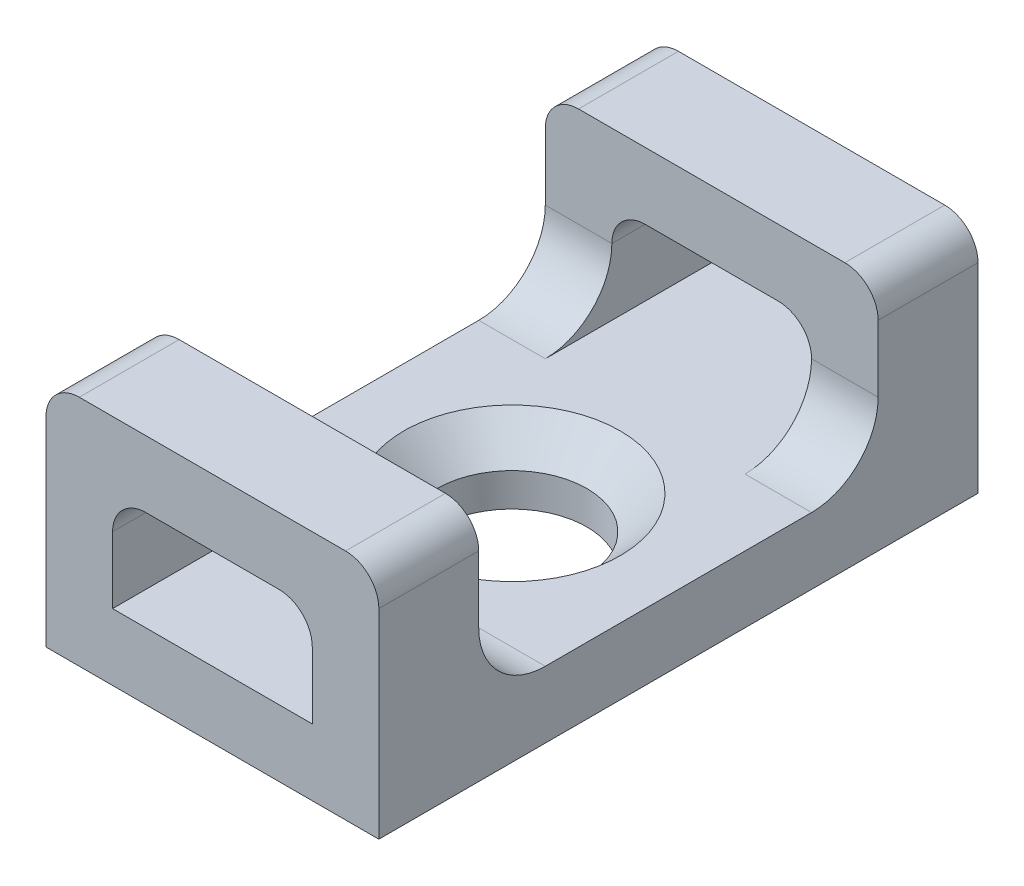
ISO-10303-21;
HEADER;
FILE_DESCRIPTION(('STEP AP214'),'2;1');
FILE_NAME('part.step','',(''),(''),'','','');
FILE_SCHEMA(('AUTOMOTIVE_DESIGN { 1 0 10303 214 1 1 1 1 }'));
ENDSEC;
DATA;
#1=APPLICATION_CONTEXT('core data for automotive mechanical design processes');
#2=APPLICATION_PROTOCOL_DEFINITION('international standard','automotive_design',2000,#1);
#3=PRODUCT_CONTEXT('',#1,'mechanical');
#4=PRODUCT('Part','Part','',(#3));
#5=PRODUCT_RELATED_PRODUCT_CATEGORY('part','',(#4));
#6=PRODUCT_DEFINITION_FORMATION('','',#4);
#7=PRODUCT_DEFINITION_CONTEXT('part definition',#1,'design');
#8=PRODUCT_DEFINITION('design','',#6,#7);
#9=PRODUCT_DEFINITION_SHAPE('','',#8);
#10=(LENGTH_UNIT() NAMED_UNIT(*) SI_UNIT(.MILLI.,.METRE.));
#11=(NAMED_UNIT(*) PLANE_ANGLE_UNIT() SI_UNIT($,.RADIAN.));
#12=(NAMED_UNIT(*) SI_UNIT($,.STERADIAN.) SOLID_ANGLE_UNIT());
#13=UNCERTAINTY_MEASURE_WITH_UNIT(LENGTH_MEASURE(1.E-05),#10,'distance_accuracy_value','');
#14=(GEOMETRIC_REPRESENTATION_CONTEXT(3) GLOBAL_UNCERTAINTY_ASSIGNED_CONTEXT((#13)) GLOBAL_UNIT_ASSIGNED_CONTEXT((#10,
#11,#12)) REPRESENTATION_CONTEXT('',''));
#15=CARTESIAN_POINT('',(0.,0.,0.));
#16=DIRECTION('',(0.,0.,1.));
#17=DIRECTION('',(1.,0.,0.));
#18=AXIS2_PLACEMENT_3D('',#15,#16,#17);
#19=CARTESIAN_POINT('',(0.,2.,0.));
#20=DIRECTION('',(0.,-1.,0.));
#21=DIRECTION('',(0.,0.,-1.));
#22=AXIS2_PLACEMENT_3D('',#19,#20,#21);
#23=PLANE('',#22);
#24=CARTESIAN_POINT('',(5.,2.,-9.));
#25=DIRECTION('',(0.,-1.,0.));
#26=DIRECTION('',(0.,0.,-1.));
#27=AXIS2_PLACEMENT_3D('',#24,#25,#26);
#28=CIRCLE('',#27,3.25);
#29=CARTESIAN_POINT('',(5.,2.,-12.25));
#30=VERTEX_POINT('',#29);
#31=EDGE_CURVE('E271',#30,#30,#28,.T.);
#32=ORIENTED_EDGE('',*,*,#31,.T.);
#33=EDGE_LOOP('',(#32));
#34=FACE_BOUND('',#33,.T.);
#35=DIRECTION('',(0.,0.,1.));
#36=VECTOR('',#35,1.);
#37=CARTESIAN_POINT('',(8.,2.,-3.));
#38=LINE('',#37,#36);
#39=CARTESIAN_POINT('',(8.,2.,-5.));
#40=VERTEX_POINT('',#39);
#41=CARTESIAN_POINT('',(8.,2.,0.));
#42=VERTEX_POINT('',#41);
#43=EDGE_CURVE('E322',#40,#42,#38,.T.);
#44=ORIENTED_EDGE('',*,*,#43,.F.);
#45=DIRECTION('',(-1.,0.,0.));
#46=VECTOR('',#45,1.);
#47=CARTESIAN_POINT('',(10.,2.,-5.));
#48=LINE('',#47,#46);
#49=CARTESIAN_POINT('',(10.,2.,-5.));
#50=VERTEX_POINT('',#49);
#51=EDGE_CURVE('E256',#40,#50,#48,.F.);
#52=ORIENTED_EDGE('',*,*,#51,.T.);
#53=DIRECTION('',(0.,0.,-1.));
#54=VECTOR('',#53,1.);
#55=CARTESIAN_POINT('',(10.,2.,0.));
#56=LINE('',#55,#54);
#57=CARTESIAN_POINT('',(10.,2.,-13.));
#58=VERTEX_POINT('',#57);
#59=EDGE_CURVE('E302',#50,#58,#56,.T.);
#60=ORIENTED_EDGE('',*,*,#59,.T.);
#61=DIRECTION('',(-1.,0.,0.));
#62=VECTOR('',#61,1.);
#63=CARTESIAN_POINT('',(0.,2.,-13.));
#64=LINE('',#63,#62);
#65=CARTESIAN_POINT('',(8.,2.,-13.));
#66=VERTEX_POINT('',#65);
#67=EDGE_CURVE('E262',#58,#66,#64,.T.);
#68=ORIENTED_EDGE('',*,*,#67,.T.);
#69=DIRECTION('',(0.,0.,-1.));
#70=VECTOR('',#69,1.);
#71=CARTESIAN_POINT('',(8.,2.,-15.));
#72=LINE('',#71,#70);
#73=CARTESIAN_POINT('',(8.,2.,-18.));
#74=VERTEX_POINT('',#73);
#75=EDGE_CURVE('E384',#66,#74,#72,.T.);
#76=ORIENTED_EDGE('',*,*,#75,.T.);
#77=DIRECTION('',(-1.,0.,0.));
#78=VECTOR('',#77,1.);
#79=CARTESIAN_POINT('',(0.,2.,-18.));
#80=LINE('',#79,#78);
#81=CARTESIAN_POINT('',(2.,2.,-18.));
#82=VERTEX_POINT('',#81);
#83=EDGE_CURVE('E289',#74,#82,#80,.T.);
#84=ORIENTED_EDGE('',*,*,#83,.T.);
#85=DIRECTION('',(0.,0.,-1.));
#86=VECTOR('',#85,1.);
#87=CARTESIAN_POINT('',(2.,2.,-15.));
#88=LINE('',#87,#86);
#89=CARTESIAN_POINT('',(2.,2.,-13.));
#90=VERTEX_POINT('',#89);
#91=EDGE_CURVE('E399',#90,#82,#88,.T.);
#92=ORIENTED_EDGE('',*,*,#91,.F.);
#93=DIRECTION('',(-1.,0.,0.));
#94=VECTOR('',#93,1.);
#95=CARTESIAN_POINT('',(0.,2.,-13.));
#96=LINE('',#95,#94);
#97=CARTESIAN_POINT('',(0.,2.,-13.));
#98=VERTEX_POINT('',#97);
#99=EDGE_CURVE('E243',#90,#98,#96,.T.);
#100=ORIENTED_EDGE('',*,*,#99,.T.);
#101=DIRECTION('',(0.,0.,1.));
#102=VECTOR('',#101,1.);
#103=CARTESIAN_POINT('',(0.,2.,0.));
#104=LINE('',#103,#102);
#105=CARTESIAN_POINT('',(0.,2.,-5.));
#106=VERTEX_POINT('',#105);
#107=EDGE_CURVE('E292',#98,#106,#104,.T.);
#108=ORIENTED_EDGE('',*,*,#107,.T.);
#109=DIRECTION('',(-1.,0.,0.));
#110=VECTOR('',#109,1.);
#111=CARTESIAN_POINT('',(2.,2.,-5.));
#112=LINE('',#111,#110);
#113=CARTESIAN_POINT('',(2.,2.,-5.));
#114=VERTEX_POINT('',#113);
#115=EDGE_CURVE('E258',#106,#114,#112,.F.);
#116=ORIENTED_EDGE('',*,*,#115,.T.);
#117=DIRECTION('',(0.,0.,1.));
#118=VECTOR('',#117,1.);
#119=CARTESIAN_POINT('',(2.,2.,-3.));
#120=LINE('',#119,#118);
#121=CARTESIAN_POINT('',(2.,2.,0.));
#122=VERTEX_POINT('',#121);
#123=EDGE_CURVE('E311',#114,#122,#120,.T.);
#124=ORIENTED_EDGE('',*,*,#123,.T.);
#125=DIRECTION('',(1.,0.,0.));
#126=VECTOR('',#125,1.);
#127=CARTESIAN_POINT('',(0.,2.,0.));
#128=LINE('',#127,#126);
#129=EDGE_CURVE('E305',#122,#42,#128,.T.);
#130=ORIENTED_EDGE('',*,*,#129,.T.);
#131=EDGE_LOOP('',(#44,#52,#60,#68,#76,#84,#92,#100,#108,#116,#124,#130));
#132=FACE_BOUND('',#131,.T.);
#133=ADVANCED_FACE('F37',(#34,#132),#23,.F.);
#134=CARTESIAN_POINT('',(0.,2.,0.));
#135=DIRECTION('',(1.,0.,0.));
#136=DIRECTION('',(0.,0.,-1.));
#137=AXIS2_PLACEMENT_3D('',#134,#135,#136);
#138=PLANE('',#137);
#139=DIRECTION('',(0.,0.,1.));
#140=VECTOR('',#139,1.);
#141=CARTESIAN_POINT('',(0.,0.,0.));
#142=LINE('',#141,#140);
#143=CARTESIAN_POINT('',(0.,0.,-18.));
#144=VERTEX_POINT('',#143);
#145=CARTESIAN_POINT('',(0.,0.,0.));
#146=VERTEX_POINT('',#145);
#147=EDGE_CURVE('E297',#144,#146,#142,.T.);
#148=ORIENTED_EDGE('',*,*,#147,.T.);
#149=DIRECTION('',(0.,-1.,0.));
#150=VECTOR('',#149,1.);
#151=CARTESIAN_POINT('',(0.,2.,0.));
#152=LINE('',#151,#150);
#153=CARTESIAN_POINT('',(0.,6.,0.));
#154=VERTEX_POINT('',#153);
#155=EDGE_CURVE('E277',#154,#146,#152,.T.);
#156=ORIENTED_EDGE('',*,*,#155,.F.);
#157=DIRECTION('',(0.,0.,1.));
#158=VECTOR('',#157,1.);
#159=CARTESIAN_POINT('',(0.,6.,-3.));
#160=LINE('',#159,#158);
#161=CARTESIAN_POINT('',(0.,6.,-3.));
#162=VERTEX_POINT('',#161);
#163=EDGE_CURVE('E332',#162,#154,#160,.T.);
#164=ORIENTED_EDGE('',*,*,#163,.F.);
#165=DIRECTION('',(0.,1.,0.));
#166=VECTOR('',#165,1.);
#167=CARTESIAN_POINT('',(0.,0.,-3.));
#168=LINE('',#167,#166);
#169=CARTESIAN_POINT('',(0.,4.,-3.));
#170=VERTEX_POINT('',#169);
#171=EDGE_CURVE('E315',#170,#162,#168,.T.);
#172=ORIENTED_EDGE('',*,*,#171,.F.);
#173=CARTESIAN_POINT('',(0.,4.,-5.));
#174=DIRECTION('',(1.,0.,0.));
#175=DIRECTION('',(0.,0.,-1.));
#176=AXIS2_PLACEMENT_3D('',#173,#174,#175);
#177=CIRCLE('',#176,2.);
#178=EDGE_CURVE('E249',#170,#106,#177,.T.);
#179=ORIENTED_EDGE('',*,*,#178,.T.);
#180=ORIENTED_EDGE('',*,*,#107,.F.);
#181=CARTESIAN_POINT('',(0.,4.,-13.));
#182=DIRECTION('',(1.,0.,0.));
#183=DIRECTION('',(0.,0.,-1.));
#184=AXIS2_PLACEMENT_3D('',#181,#182,#183);
#185=CIRCLE('',#184,2.);
#186=CARTESIAN_POINT('',(0.,4.,-15.));
#187=VERTEX_POINT('',#186);
#188=EDGE_CURVE('E52',#98,#187,#185,.T.);
#189=ORIENTED_EDGE('',*,*,#188,.T.);
#190=DIRECTION('',(0.,1.,0.));
#191=VECTOR('',#190,1.);
#192=CARTESIAN_POINT('',(0.,0.,-15.));
#193=LINE('',#192,#191);
#194=CARTESIAN_POINT('',(0.,6.,-15.));
#195=VERTEX_POINT('',#194);
#196=EDGE_CURVE('E214',#187,#195,#193,.T.);
#197=ORIENTED_EDGE('',*,*,#196,.T.);
#198=DIRECTION('',(0.,0.,-1.));
#199=VECTOR('',#198,1.);
#200=CARTESIAN_POINT('',(0.,6.,-15.));
#201=LINE('',#200,#199);
#202=CARTESIAN_POINT('',(0.,6.,-18.));
#203=VERTEX_POINT('',#202);
#204=EDGE_CURVE('E396',#195,#203,#201,.T.);
#205=ORIENTED_EDGE('',*,*,#204,.T.);
#206=DIRECTION('',(0.,-1.,0.));
#207=VECTOR('',#206,1.);
#208=CARTESIAN_POINT('',(0.,2.,-18.));
#209=LINE('',#208,#207);
#210=EDGE_CURVE('E286',#203,#144,#209,.T.);
#211=ORIENTED_EDGE('',*,*,#210,.T.);
#212=EDGE_LOOP('',(#148,#156,#164,#172,#179,#180,#189,#197,#205,#211));
#213=FACE_BOUND('',#212,.T.);
#214=ADVANCED_FACE('F488',(#213),#138,.F.);
#215=CARTESIAN_POINT('',(0.,2.,0.));
#216=DIRECTION('',(0.,0.,-1.));
#217=DIRECTION('',(-1.,0.,0.));
#218=AXIS2_PLACEMENT_3D('',#215,#216,#217);
#219=PLANE('',#218);
#220=DIRECTION('',(0.,1.,0.));
#221=VECTOR('',#220,1.);
#222=CARTESIAN_POINT('',(8.,0.,0.));
#223=LINE('',#222,#221);
#224=CARTESIAN_POINT('',(8.,4.,0.));
#225=VERTEX_POINT('',#224);
#226=EDGE_CURVE('E347',#42,#225,#223,.T.);
#227=ORIENTED_EDGE('',*,*,#226,.F.);
#228=ORIENTED_EDGE('',*,*,#129,.F.);
#229=DIRECTION('',(0.,1.,0.));
#230=VECTOR('',#229,1.);
#231=CARTESIAN_POINT('',(2.,0.,0.));
#232=LINE('',#231,#230);
#233=CARTESIAN_POINT('',(2.,4.,0.));
#234=VERTEX_POINT('',#233);
#235=EDGE_CURVE('E239',#122,#234,#232,.T.);
#236=ORIENTED_EDGE('',*,*,#235,.T.);
#237=CARTESIAN_POINT('',(3.,4.,0.));
#238=DIRECTION('',(0.,0.,1.));
#239=DIRECTION('',(1.,0.,0.));
#240=AXIS2_PLACEMENT_3D('',#237,#238,#239);
#241=CIRCLE('',#240,1.);
#242=CARTESIAN_POINT('',(3.,5.,0.));
#243=VERTEX_POINT('',#242);
#244=EDGE_CURVE('E355',#234,#243,#241,.F.);
#245=ORIENTED_EDGE('',*,*,#244,.T.);
#246=DIRECTION('',(1.,0.,0.));
#247=VECTOR('',#246,1.);
#248=CARTESIAN_POINT('',(0.,5.,0.));
#249=LINE('',#248,#247);
#250=CARTESIAN_POINT('',(7.,5.,0.));
#251=VERTEX_POINT('',#250);
#252=EDGE_CURVE('E352',#243,#251,#249,.T.);
#253=ORIENTED_EDGE('',*,*,#252,.T.);
#254=CARTESIAN_POINT('',(7.,4.,0.));
#255=DIRECTION('',(0.,0.,1.));
#256=DIRECTION('',(1.,0.,0.));
#257=AXIS2_PLACEMENT_3D('',#254,#255,#256);
#258=CIRCLE('',#257,1.);
#259=EDGE_CURVE('E349',#225,#251,#258,.T.);
#260=ORIENTED_EDGE('',*,*,#259,.F.);
#261=EDGE_LOOP('',(#227,#228,#236,#245,#253,#260));
#262=FACE_BOUND('',#261,.T.);
#263=DIRECTION('',(1.,0.,0.));
#264=VECTOR('',#263,1.);
#265=CARTESIAN_POINT('',(0.,0.,0.));
#266=LINE('',#265,#264);
#267=CARTESIAN_POINT('',(10.,0.,0.));
#268=VERTEX_POINT('',#267);
#269=EDGE_CURVE('E295',#146,#268,#266,.T.);
#270=ORIENTED_EDGE('',*,*,#269,.T.);
#271=DIRECTION('',(0.,-1.,0.));
#272=VECTOR('',#271,1.);
#273=CARTESIAN_POINT('',(10.,2.,0.));
#274=LINE('',#273,#272);
#275=CARTESIAN_POINT('',(10.,6.,0.));
#276=VERTEX_POINT('',#275);
#277=EDGE_CURVE('E280',#276,#268,#274,.T.);
#278=ORIENTED_EDGE('',*,*,#277,.F.);
#279=CARTESIAN_POINT('',(9.,6.,0.));
#280=DIRECTION('',(0.,0.,1.));
#281=DIRECTION('',(1.,0.,0.));
#282=AXIS2_PLACEMENT_3D('',#279,#280,#281);
#283=CIRCLE('',#282,1.);
#284=CARTESIAN_POINT('',(9.,7.,0.));
#285=VERTEX_POINT('',#284);
#286=EDGE_CURVE('E344',#276,#285,#283,.T.);
#287=ORIENTED_EDGE('',*,*,#286,.T.);
#288=DIRECTION('',(-1.,0.,0.));
#289=VECTOR('',#288,1.);
#290=CARTESIAN_POINT('',(0.,7.00000000000001,0.));
#291=LINE('',#290,#289);
#292=CARTESIAN_POINT('',(1.,7.,0.));
#293=VERTEX_POINT('',#292);
#294=EDGE_CURVE('E341',#285,#293,#291,.T.);
#295=ORIENTED_EDGE('',*,*,#294,.T.);
#296=CARTESIAN_POINT('',(1.,6.,0.));
#297=DIRECTION('',(0.,0.,1.));
#298=DIRECTION('',(1.,0.,0.));
#299=AXIS2_PLACEMENT_3D('',#296,#297,#298);
#300=CIRCLE('',#299,1.);
#301=EDGE_CURVE('E337',#293,#154,#300,.T.);
#302=ORIENTED_EDGE('',*,*,#301,.T.);
#303=ORIENTED_EDGE('',*,*,#155,.T.);
#304=EDGE_LOOP('',(#270,#278,#287,#295,#302,#303));
#305=FACE_BOUND('',#304,.T.);
#306=ADVANCED_FACE('F538',(#262,#305),#219,.F.);
#307=CARTESIAN_POINT('',(10.,2.,0.));
#308=DIRECTION('',(-1.,0.,0.));
#309=DIRECTION('',(0.,0.,1.));
#310=AXIS2_PLACEMENT_3D('',#307,#308,#309);
#311=PLANE('',#310);
#312=DIRECTION('',(0.,0.,-1.));
#313=VECTOR('',#312,1.);
#314=CARTESIAN_POINT('',(10.,0.,0.));
#315=LINE('',#314,#313);
#316=CARTESIAN_POINT('',(10.,0.,-18.));
#317=VERTEX_POINT('',#316);
#318=EDGE_CURVE('E293',#268,#317,#315,.T.);
#319=ORIENTED_EDGE('',*,*,#318,.T.);
#320=DIRECTION('',(0.,-1.,0.));
#321=VECTOR('',#320,1.);
#322=CARTESIAN_POINT('',(10.,2.,-18.));
#323=LINE('',#322,#321);
#324=CARTESIAN_POINT('',(10.,6.,-18.));
#325=VERTEX_POINT('',#324);
#326=EDGE_CURVE('E283',#325,#317,#323,.T.);
#327=ORIENTED_EDGE('',*,*,#326,.F.);
#328=DIRECTION('',(0.,0.,-1.));
#329=VECTOR('',#328,1.);
#330=CARTESIAN_POINT('',(10.,6.,-15.));
#331=LINE('',#330,#329);
#332=CARTESIAN_POINT('',(10.,6.,-15.));
#333=VERTEX_POINT('',#332);
#334=EDGE_CURVE('E387',#333,#325,#331,.T.);
#335=ORIENTED_EDGE('',*,*,#334,.F.);
#336=DIRECTION('',(0.,1.,0.));
#337=VECTOR('',#336,1.);
#338=CARTESIAN_POINT('',(10.,0.,-15.));
#339=LINE('',#338,#337);
#340=CARTESIAN_POINT('',(10.,4.,-15.));
#341=VERTEX_POINT('',#340);
#342=EDGE_CURVE('E426',#341,#333,#339,.T.);
#343=ORIENTED_EDGE('',*,*,#342,.F.);
#344=CARTESIAN_POINT('',(10.,4.,-13.));
#345=DIRECTION('',(-1.,0.,0.));
#346=DIRECTION('',(0.,0.,1.));
#347=AXIS2_PLACEMENT_3D('',#344,#345,#346);
#348=CIRCLE('',#347,2.);
#349=EDGE_CURVE('E11',#341,#58,#348,.T.);
#350=ORIENTED_EDGE('',*,*,#349,.T.);
#351=ORIENTED_EDGE('',*,*,#59,.F.);
#352=CARTESIAN_POINT('',(10.,4.,-5.));
#353=DIRECTION('',(-1.,0.,0.));
#354=DIRECTION('',(0.,0.,1.));
#355=AXIS2_PLACEMENT_3D('',#352,#353,#354);
#356=CIRCLE('',#355,2.);
#357=CARTESIAN_POINT('',(10.,4.,-3.));
#358=VERTEX_POINT('',#357);
#359=EDGE_CURVE('E251',#50,#358,#356,.T.);
#360=ORIENTED_EDGE('',*,*,#359,.T.);
#361=DIRECTION('',(0.,1.,0.));
#362=VECTOR('',#361,1.);
#363=CARTESIAN_POINT('',(10.,0.,-3.));
#364=LINE('',#363,#362);
#365=CARTESIAN_POINT('',(10.,6.,-3.));
#366=VERTEX_POINT('',#365);
#367=EDGE_CURVE('E370',#358,#366,#364,.T.);
#368=ORIENTED_EDGE('',*,*,#367,.T.);
#369=DIRECTION('',(0.,0.,1.));
#370=VECTOR('',#369,1.);
#371=CARTESIAN_POINT('',(10.,6.,-3.));
#372=LINE('',#371,#370);
#373=EDGE_CURVE('E325',#366,#276,#372,.T.);
#374=ORIENTED_EDGE('',*,*,#373,.T.);
#375=ORIENTED_EDGE('',*,*,#277,.T.);
#376=EDGE_LOOP('',(#319,#327,#335,#343,#350,#351,#360,#368,#374,#375));
#377=FACE_BOUND('',#376,.T.);
#378=ADVANCED_FACE('F451',(#377),#311,.F.);
#379=CARTESIAN_POINT('',(0.,2.,-18.));
#380=DIRECTION('',(0.,0.,1.));
#381=DIRECTION('',(1.,0.,0.));
#382=AXIS2_PLACEMENT_3D('',#379,#380,#381);
#383=PLANE('',#382);
#384=ORIENTED_EDGE('',*,*,#83,.F.);
#385=DIRECTION('',(0.,1.,0.));
#386=VECTOR('',#385,1.);
#387=CARTESIAN_POINT('',(8.,0.,-18.));
#388=LINE('',#387,#386);
#389=CARTESIAN_POINT('',(8.,4.,-18.));
#390=VERTEX_POINT('',#389);
#391=EDGE_CURVE('E407',#74,#390,#388,.T.);
#392=ORIENTED_EDGE('',*,*,#391,.T.);
#393=CARTESIAN_POINT('',(7.,4.,-18.));
#394=DIRECTION('',(0.,0.,1.));
#395=DIRECTION('',(1.,0.,0.));
#396=AXIS2_PLACEMENT_3D('',#393,#394,#395);
#397=CIRCLE('',#396,1.);
#398=CARTESIAN_POINT('',(7.,5.,-18.));
#399=VERTEX_POINT('',#398);
#400=EDGE_CURVE('E410',#390,#399,#397,.T.);
#401=ORIENTED_EDGE('',*,*,#400,.T.);
#402=DIRECTION('',(1.,0.,0.));
#403=VECTOR('',#402,1.);
#404=CARTESIAN_POINT('',(0.,5.,-18.));
#405=LINE('',#404,#403);
#406=CARTESIAN_POINT('',(3.,5.,-18.));
#407=VERTEX_POINT('',#406);
#408=EDGE_CURVE('E413',#407,#399,#405,.T.);
#409=ORIENTED_EDGE('',*,*,#408,.F.);
#410=CARTESIAN_POINT('',(3.,4.,-18.));
#411=DIRECTION('',(0.,0.,1.));
#412=DIRECTION('',(1.,0.,0.));
#413=AXIS2_PLACEMENT_3D('',#410,#411,#412);
#414=CIRCLE('',#413,1.);
#415=CARTESIAN_POINT('',(2.,4.,-18.));
#416=VERTEX_POINT('',#415);
#417=EDGE_CURVE('E416',#416,#407,#414,.F.);
#418=ORIENTED_EDGE('',*,*,#417,.F.);
#419=DIRECTION('',(0.,1.,0.));
#420=VECTOR('',#419,1.);
#421=CARTESIAN_POINT('',(2.,0.,-18.));
#422=LINE('',#421,#420);
#423=EDGE_CURVE('E238',#82,#416,#422,.T.);
#424=ORIENTED_EDGE('',*,*,#423,.F.);
#425=EDGE_LOOP('',(#384,#392,#401,#409,#418,#424));
#426=FACE_BOUND('',#425,.T.);
#427=DIRECTION('',(-1.,0.,0.));
#428=VECTOR('',#427,1.);
#429=CARTESIAN_POINT('',(0.,0.,-18.));
#430=LINE('',#429,#428);
#431=EDGE_CURVE('E290',#317,#144,#430,.T.);
#432=ORIENTED_EDGE('',*,*,#431,.T.);
#433=ORIENTED_EDGE('',*,*,#210,.F.);
#434=CARTESIAN_POINT('',(1.,6.,-18.));
#435=DIRECTION('',(0.,0.,1.));
#436=DIRECTION('',(1.,0.,0.));
#437=AXIS2_PLACEMENT_3D('',#434,#435,#436);
#438=CIRCLE('',#437,1.);
#439=CARTESIAN_POINT('',(1.,7.,-18.));
#440=VERTEX_POINT('',#439);
#441=EDGE_CURVE('E229',#440,#203,#438,.T.);
#442=ORIENTED_EDGE('',*,*,#441,.F.);
#443=DIRECTION('',(-1.,0.,0.));
#444=VECTOR('',#443,1.);
#445=CARTESIAN_POINT('',(0.,7.00000000000001,-18.));
#446=LINE('',#445,#444);
#447=CARTESIAN_POINT('',(9.,7.,-18.));
#448=VERTEX_POINT('',#447);
#449=EDGE_CURVE('E403',#448,#440,#446,.T.);
#450=ORIENTED_EDGE('',*,*,#449,.F.);
#451=CARTESIAN_POINT('',(9.,6.,-18.));
#452=DIRECTION('',(0.,0.,1.));
#453=DIRECTION('',(1.,0.,0.));
#454=AXIS2_PLACEMENT_3D('',#451,#452,#453);
#455=CIRCLE('',#454,1.);
#456=EDGE_CURVE('E405',#325,#448,#455,.T.);
#457=ORIENTED_EDGE('',*,*,#456,.F.);
#458=ORIENTED_EDGE('',*,*,#326,.T.);
#459=EDGE_LOOP('',(#432,#433,#442,#450,#457,#458));
#460=FACE_BOUND('',#459,.T.);
#461=ADVANCED_FACE('F507',(#426,#460),#383,.F.);
#462=CARTESIAN_POINT('',(0.,0.,0.));
#463=DIRECTION('',(0.,-1.,0.));
#464=DIRECTION('',(0.,0.,-1.));
#465=AXIS2_PLACEMENT_3D('',#462,#463,#464);
#466=PLANE('',#465);
#467=CARTESIAN_POINT('',(5.,0.,-9.));
#468=DIRECTION('',(0.,1.,0.));
#469=DIRECTION('',(0.,0.,1.));
#470=AXIS2_PLACEMENT_3D('',#467,#468,#469);
#471=CIRCLE('',#470,2.25);
#472=CARTESIAN_POINT('',(5.,0.,-6.75));
#473=VERTEX_POINT('',#472);
#474=EDGE_CURVE('E300',#473,#473,#471,.T.);
#475=ORIENTED_EDGE('',*,*,#474,.T.);
#476=EDGE_LOOP('',(#475));
#477=FACE_BOUND('',#476,.T.);
#478=ORIENTED_EDGE('',*,*,#147,.F.);
#479=ORIENTED_EDGE('',*,*,#431,.F.);
#480=ORIENTED_EDGE('',*,*,#318,.F.);
#481=ORIENTED_EDGE('',*,*,#269,.F.);
#482=EDGE_LOOP('',(#478,#479,#480,#481));
#483=FACE_BOUND('',#482,.T.);
#484=ADVANCED_FACE('F505',(#477,#483),#466,.T.);
#485=CARTESIAN_POINT('',(5.,0.,-9.));
#486=DIRECTION('',(0.,1.,0.));
#487=DIRECTION('',(0.,0.,1.));
#488=AXIS2_PLACEMENT_3D('',#485,#486,#487);
#489=CYLINDRICAL_SURFACE('',#488,2.25);
#490=CARTESIAN_POINT('',(5.,0.999999999999999,-9.));
#491=DIRECTION('',(0.,-1.,0.));
#492=DIRECTION('',(0.,0.,-1.));
#493=AXIS2_PLACEMENT_3D('',#490,#491,#492);
#494=CIRCLE('',#493,2.25);
#495=CARTESIAN_POINT('',(5.,0.999999999999999,-11.25));
#496=VERTEX_POINT('',#495);
#497=EDGE_CURVE('E274',#496,#496,#494,.F.);
#498=ORIENTED_EDGE('',*,*,#497,.T.);
#499=EDGE_LOOP('',(#498));
#500=FACE_BOUND('',#499,.T.);
#501=ORIENTED_EDGE('',*,*,#474,.F.);
#502=EDGE_LOOP('',(#501));
#503=FACE_BOUND('',#502,.T.);
#504=ADVANCED_FACE('F542',(#500,#503),#489,.F.);
#505=CARTESIAN_POINT('',(2.,0.,-3.));
#506=DIRECTION('',(1.,0.,0.));
#507=DIRECTION('',(0.,1.,0.));
#508=AXIS2_PLACEMENT_3D('',#505,#506,#507);
#509=PLANE('',#508);
#510=ORIENTED_EDGE('',*,*,#235,.F.);
#511=ORIENTED_EDGE('',*,*,#123,.F.);
#512=CARTESIAN_POINT('',(2.,4.,-5.));
#513=DIRECTION('',(1.,0.,0.));
#514=DIRECTION('',(0.,1.,0.));
#515=AXIS2_PLACEMENT_3D('',#512,#513,#514);
#516=CIRCLE('',#515,2.);
#517=CARTESIAN_POINT('',(2.,4.,-3.));
#518=VERTEX_POINT('',#517);
#519=EDGE_CURVE('E245',#114,#518,#516,.F.);
#520=ORIENTED_EDGE('',*,*,#519,.T.);
#521=DIRECTION('',(0.,0.,1.));
#522=VECTOR('',#521,1.);
#523=CARTESIAN_POINT('',(2.,4.,-3.));
#524=LINE('',#523,#522);
#525=EDGE_CURVE('E312',#518,#234,#524,.T.);
#526=ORIENTED_EDGE('',*,*,#525,.T.);
#527=EDGE_LOOP('',(#510,#511,#520,#526));
#528=FACE_BOUND('',#527,.T.);
#529=ADVANCED_FACE('F480',(#528),#509,.T.);
#530=CARTESIAN_POINT('',(1.,6.,-3.));
#531=DIRECTION('',(0.,0.,1.));
#532=DIRECTION('',(1.,0.,0.));
#533=AXIS2_PLACEMENT_3D('',#530,#531,#532);
#534=CYLINDRICAL_SURFACE('',#533,1.);
#535=ORIENTED_EDGE('',*,*,#301,.F.);
#536=DIRECTION('',(0.,0.,1.));
#537=VECTOR('',#536,1.);
#538=CARTESIAN_POINT('',(1.,7.,-3.));
#539=LINE('',#538,#537);
#540=CARTESIAN_POINT('',(1.,7.,-3.));
#541=VERTEX_POINT('',#540);
#542=EDGE_CURVE('E330',#541,#293,#539,.T.);
#543=ORIENTED_EDGE('',*,*,#542,.F.);
#544=CARTESIAN_POINT('',(1.,6.,-3.));
#545=DIRECTION('',(0.,0.,1.));
#546=DIRECTION('',(1.,0.,0.));
#547=AXIS2_PLACEMENT_3D('',#544,#545,#546);
#548=CIRCLE('',#547,1.);
#549=EDGE_CURVE('E361',#541,#162,#548,.T.);
#550=ORIENTED_EDGE('',*,*,#549,.T.);
#551=ORIENTED_EDGE('',*,*,#163,.T.);
#552=EDGE_LOOP('',(#535,#543,#550,#551));
#553=FACE_BOUND('',#552,.T.);
#554=ADVANCED_FACE('F491',(#553),#534,.T.);
#555=CARTESIAN_POINT('',(0.,7.00000000000001,-3.));
#556=DIRECTION('',(0.,1.,0.));
#557=DIRECTION('',(-1.,0.,0.));
#558=AXIS2_PLACEMENT_3D('',#555,#556,#557);
#559=PLANE('',#558);
#560=ORIENTED_EDGE('',*,*,#294,.F.);
#561=DIRECTION('',(0.,0.,1.));
#562=VECTOR('',#561,1.);
#563=CARTESIAN_POINT('',(9.,7.,-3.));
#564=LINE('',#563,#562);
#565=CARTESIAN_POINT('',(9.,7.,-3.));
#566=VERTEX_POINT('',#565);
#567=EDGE_CURVE('E328',#566,#285,#564,.T.);
#568=ORIENTED_EDGE('',*,*,#567,.F.);
#569=DIRECTION('',(-1.,0.,0.));
#570=VECTOR('',#569,1.);
#571=CARTESIAN_POINT('',(0.,7.00000000000001,-3.));
#572=LINE('',#571,#570);
#573=EDGE_CURVE('E364',#566,#541,#572,.T.);
#574=ORIENTED_EDGE('',*,*,#573,.T.);
#575=ORIENTED_EDGE('',*,*,#542,.T.);
#576=EDGE_LOOP('',(#560,#568,#574,#575));
#577=FACE_BOUND('',#576,.T.);
#578=ADVANCED_FACE('F495',(#577),#559,.T.);
#579=CARTESIAN_POINT('',(9.,6.,-3.));
#580=DIRECTION('',(0.,0.,1.));
#581=DIRECTION('',(1.,0.,0.));
#582=AXIS2_PLACEMENT_3D('',#579,#580,#581);
#583=CYLINDRICAL_SURFACE('',#582,1.);
#584=ORIENTED_EDGE('',*,*,#286,.F.);
#585=ORIENTED_EDGE('',*,*,#373,.F.);
#586=CARTESIAN_POINT('',(9.,6.,-3.));
#587=DIRECTION('',(0.,0.,1.));
#588=DIRECTION('',(1.,0.,0.));
#589=AXIS2_PLACEMENT_3D('',#586,#587,#588);
#590=CIRCLE('',#589,1.);
#591=EDGE_CURVE('E367',#366,#566,#590,.T.);
#592=ORIENTED_EDGE('',*,*,#591,.T.);
#593=ORIENTED_EDGE('',*,*,#567,.T.);
#594=EDGE_LOOP('',(#584,#585,#592,#593));
#595=FACE_BOUND('',#594,.T.);
#596=ADVANCED_FACE('F498',(#595),#583,.T.);
#597=CARTESIAN_POINT('',(8.,0.,-3.));
#598=DIRECTION('',(1.,0.,0.));
#599=DIRECTION('',(0.,0.,-1.));
#600=AXIS2_PLACEMENT_3D('',#597,#598,#599);
#601=PLANE('',#600);
#602=ORIENTED_EDGE('',*,*,#226,.T.);
#603=DIRECTION('',(0.,0.,1.));
#604=VECTOR('',#603,1.);
#605=CARTESIAN_POINT('',(8.,4.,-3.));
#606=LINE('',#605,#604);
#607=CARTESIAN_POINT('',(8.,4.,-3.));
#608=VERTEX_POINT('',#607);
#609=EDGE_CURVE('E319',#608,#225,#606,.T.);
#610=ORIENTED_EDGE('',*,*,#609,.F.);
#611=CARTESIAN_POINT('',(8.,4.,-5.));
#612=DIRECTION('',(1.,0.,0.));
#613=DIRECTION('',(0.,0.,-1.));
#614=AXIS2_PLACEMENT_3D('',#611,#612,#613);
#615=CIRCLE('',#614,2.);
#616=EDGE_CURVE('E217',#608,#40,#615,.T.);
#617=ORIENTED_EDGE('',*,*,#616,.T.);
#618=ORIENTED_EDGE('',*,*,#43,.T.);
#619=EDGE_LOOP('',(#602,#610,#617,#618));
#620=FACE_BOUND('',#619,.T.);
#621=ADVANCED_FACE('F464',(#620),#601,.F.);
#622=CARTESIAN_POINT('',(7.,4.,-3.));
#623=DIRECTION('',(0.,0.,1.));
#624=DIRECTION('',(1.,0.,0.));
#625=AXIS2_PLACEMENT_3D('',#622,#623,#624);
#626=CYLINDRICAL_SURFACE('',#625,1.);
#627=ORIENTED_EDGE('',*,*,#259,.T.);
#628=DIRECTION('',(0.,0.,1.));
#629=VECTOR('',#628,1.);
#630=CARTESIAN_POINT('',(7.,5.,-3.));
#631=LINE('',#630,#629);
#632=CARTESIAN_POINT('',(7.,5.,-3.));
#633=VERTEX_POINT('',#632);
#634=EDGE_CURVE('E317',#633,#251,#631,.T.);
#635=ORIENTED_EDGE('',*,*,#634,.F.);
#636=CARTESIAN_POINT('',(7.,4.,-3.));
#637=DIRECTION('',(0.,0.,1.));
#638=DIRECTION('',(1.,0.,0.));
#639=AXIS2_PLACEMENT_3D('',#636,#637,#638);
#640=CIRCLE('',#639,1.);
#641=EDGE_CURVE('E372',#608,#633,#640,.T.);
#642=ORIENTED_EDGE('',*,*,#641,.F.);
#643=ORIENTED_EDGE('',*,*,#609,.T.);
#644=EDGE_LOOP('',(#627,#635,#642,#643));
#645=FACE_BOUND('',#644,.T.);
#646=ADVANCED_FACE('F468',(#645),#626,.F.);
#647=CARTESIAN_POINT('',(0.,5.,-3.));
#648=DIRECTION('',(0.,-1.,0.));
#649=DIRECTION('',(0.,0.,-1.));
#650=AXIS2_PLACEMENT_3D('',#647,#648,#649);
#651=PLANE('',#650);
#652=ORIENTED_EDGE('',*,*,#252,.F.);
#653=DIRECTION('',(0.,0.,1.));
#654=VECTOR('',#653,1.);
#655=CARTESIAN_POINT('',(3.,5.,-3.));
#656=LINE('',#655,#654);
#657=CARTESIAN_POINT('',(3.,5.,-3.));
#658=VERTEX_POINT('',#657);
#659=EDGE_CURVE('E314',#658,#243,#656,.T.);
#660=ORIENTED_EDGE('',*,*,#659,.F.);
#661=DIRECTION('',(1.,0.,0.));
#662=VECTOR('',#661,1.);
#663=CARTESIAN_POINT('',(0.,5.,-3.));
#664=LINE('',#663,#662);
#665=EDGE_CURVE('E374',#658,#633,#664,.T.);
#666=ORIENTED_EDGE('',*,*,#665,.T.);
#667=ORIENTED_EDGE('',*,*,#634,.T.);
#668=EDGE_LOOP('',(#652,#660,#666,#667));
#669=FACE_BOUND('',#668,.T.);
#670=ADVANCED_FACE('F471',(#669),#651,.T.);
#671=CARTESIAN_POINT('',(3.,4.,-3.));
#672=DIRECTION('',(0.,0.,1.));
#673=DIRECTION('',(1.,0.,0.));
#674=AXIS2_PLACEMENT_3D('',#671,#672,#673);
#675=CYLINDRICAL_SURFACE('',#674,1.);
#676=ORIENTED_EDGE('',*,*,#244,.F.);
#677=ORIENTED_EDGE('',*,*,#525,.F.);
#678=CARTESIAN_POINT('',(3.,4.,-3.));
#679=DIRECTION('',(0.,0.,1.));
#680=DIRECTION('',(1.,0.,0.));
#681=AXIS2_PLACEMENT_3D('',#678,#679,#680);
#682=CIRCLE('',#681,1.);
#683=EDGE_CURVE('E340',#518,#658,#682,.F.);
#684=ORIENTED_EDGE('',*,*,#683,.T.);
#685=ORIENTED_EDGE('',*,*,#659,.T.);
#686=EDGE_LOOP('',(#676,#677,#684,#685));
#687=FACE_BOUND('',#686,.T.);
#688=ADVANCED_FACE('F477',(#687),#675,.F.);
#689=CARTESIAN_POINT('',(0.,0.,-3.));
#690=DIRECTION('',(0.,0.,1.));
#691=DIRECTION('',(1.,0.,0.));
#692=AXIS2_PLACEMENT_3D('',#689,#690,#691);
#693=PLANE('',#692);
#694=ORIENTED_EDGE('',*,*,#367,.F.);
#695=DIRECTION('',(-1.,0.,0.));
#696=VECTOR('',#695,1.);
#697=CARTESIAN_POINT('',(8.,4.,-3.));
#698=LINE('',#697,#696);
#699=EDGE_CURVE('E265',#358,#608,#698,.T.);
#700=ORIENTED_EDGE('',*,*,#699,.T.);
#701=ORIENTED_EDGE('',*,*,#641,.T.);
#702=ORIENTED_EDGE('',*,*,#665,.F.);
#703=ORIENTED_EDGE('',*,*,#683,.F.);
#704=DIRECTION('',(-1.,0.,0.));
#705=VECTOR('',#704,1.);
#706=CARTESIAN_POINT('',(0.,4.,-3.));
#707=LINE('',#706,#705);
#708=EDGE_CURVE('E268',#518,#170,#707,.T.);
#709=ORIENTED_EDGE('',*,*,#708,.T.);
#710=ORIENTED_EDGE('',*,*,#171,.T.);
#711=ORIENTED_EDGE('',*,*,#549,.F.);
#712=ORIENTED_EDGE('',*,*,#573,.F.);
#713=ORIENTED_EDGE('',*,*,#591,.F.);
#714=EDGE_LOOP('',(#694,#700,#701,#702,#703,#709,#710,#711,#712,#713));
#715=FACE_BOUND('',#714,.T.);
#716=ADVANCED_FACE('F458',(#715),#693,.F.);
#717=CARTESIAN_POINT('',(5.,0.999999999999999,-9.));
#718=DIRECTION('',(0.,1.,0.));
#719=DIRECTION('',(0.,0.,1.));
#720=AXIS2_PLACEMENT_3D('',#717,#718,#719);
#721=CONICAL_SURFACE('',#720,2.25,0.785398163397449);
#722=ORIENTED_EDGE('',*,*,#31,.F.);
#723=EDGE_LOOP('',(#722));
#724=FACE_BOUND('',#723,.T.);
#725=ORIENTED_EDGE('',*,*,#497,.F.);
#726=EDGE_LOOP('',(#725));
#727=FACE_BOUND('',#726,.T.);
#728=ADVANCED_FACE('F555',(#724,#727),#721,.F.);
#729=CARTESIAN_POINT('',(2.,0.,-15.));
#730=DIRECTION('',(-1.,0.,0.));
#731=DIRECTION('',(0.,-1.,0.));
#732=AXIS2_PLACEMENT_3D('',#729,#730,#731);
#733=PLANE('',#732);
#734=ORIENTED_EDGE('',*,*,#423,.T.);
#735=DIRECTION('',(0.,0.,-1.));
#736=VECTOR('',#735,1.);
#737=CARTESIAN_POINT('',(2.,4.,-15.));
#738=LINE('',#737,#736);
#739=CARTESIAN_POINT('',(2.,4.,-15.));
#740=VERTEX_POINT('',#739);
#741=EDGE_CURVE('E223',#740,#416,#738,.T.);
#742=ORIENTED_EDGE('',*,*,#741,.F.);
#743=CARTESIAN_POINT('',(2.,4.,-13.));
#744=DIRECTION('',(-1.,0.,0.));
#745=DIRECTION('',(0.,-1.,0.));
#746=AXIS2_PLACEMENT_3D('',#743,#744,#745);
#747=CIRCLE('',#746,2.);
#748=EDGE_CURVE('E235',#740,#90,#747,.T.);
#749=ORIENTED_EDGE('',*,*,#748,.T.);
#750=ORIENTED_EDGE('',*,*,#91,.T.);
#751=EDGE_LOOP('',(#734,#742,#749,#750));
#752=FACE_BOUND('',#751,.T.);
#753=ADVANCED_FACE('F233',(#752),#733,.F.);
#754=CARTESIAN_POINT('',(3.,4.,-15.));
#755=DIRECTION('',(0.,0.,-1.));
#756=DIRECTION('',(-1.,0.,0.));
#757=AXIS2_PLACEMENT_3D('',#754,#755,#756);
#758=CYLINDRICAL_SURFACE('',#757,1.);
#759=ORIENTED_EDGE('',*,*,#417,.T.);
#760=DIRECTION('',(0.,0.,-1.));
#761=VECTOR('',#760,1.);
#762=CARTESIAN_POINT('',(3.,5.,-15.));
#763=LINE('',#762,#761);
#764=CARTESIAN_POINT('',(3.,5.,-15.));
#765=VERTEX_POINT('',#764);
#766=EDGE_CURVE('E226',#765,#407,#763,.T.);
#767=ORIENTED_EDGE('',*,*,#766,.F.);
#768=CARTESIAN_POINT('',(3.,4.,-15.));
#769=DIRECTION('',(0.,0.,1.));
#770=DIRECTION('',(1.,0.,0.));
#771=AXIS2_PLACEMENT_3D('',#768,#769,#770);
#772=CIRCLE('',#771,1.);
#773=EDGE_CURVE('E211',#740,#765,#772,.F.);
#774=ORIENTED_EDGE('',*,*,#773,.F.);
#775=ORIENTED_EDGE('',*,*,#741,.T.);
#776=EDGE_LOOP('',(#759,#767,#774,#775));
#777=FACE_BOUND('',#776,.T.);
#778=ADVANCED_FACE('F222',(#777),#758,.F.);
#779=CARTESIAN_POINT('',(0.,5.,-15.));
#780=DIRECTION('',(0.,1.,0.));
#781=DIRECTION('',(0.,0.,1.));
#782=AXIS2_PLACEMENT_3D('',#779,#780,#781);
#783=PLANE('',#782);
#784=ORIENTED_EDGE('',*,*,#408,.T.);
#785=DIRECTION('',(0.,0.,-1.));
#786=VECTOR('',#785,1.);
#787=CARTESIAN_POINT('',(7.,5.,-15.));
#788=LINE('',#787,#786);
#789=CARTESIAN_POINT('',(7.,5.,-15.));
#790=VERTEX_POINT('',#789);
#791=EDGE_CURVE('E380',#790,#399,#788,.T.);
#792=ORIENTED_EDGE('',*,*,#791,.F.);
#793=DIRECTION('',(1.,0.,0.));
#794=VECTOR('',#793,1.);
#795=CARTESIAN_POINT('',(0.,5.,-15.));
#796=LINE('',#795,#794);
#797=EDGE_CURVE('E228',#765,#790,#796,.T.);
#798=ORIENTED_EDGE('',*,*,#797,.F.);
#799=ORIENTED_EDGE('',*,*,#766,.T.);
#800=EDGE_LOOP('',(#784,#792,#798,#799));
#801=FACE_BOUND('',#800,.T.);
#802=ADVANCED_FACE('F433',(#801),#783,.F.);
#803=CARTESIAN_POINT('',(7.,4.,-15.));
#804=DIRECTION('',(0.,0.,-1.));
#805=DIRECTION('',(-1.,0.,0.));
#806=AXIS2_PLACEMENT_3D('',#803,#804,#805);
#807=CYLINDRICAL_SURFACE('',#806,1.);
#808=ORIENTED_EDGE('',*,*,#400,.F.);
#809=DIRECTION('',(0.,0.,-1.));
#810=VECTOR('',#809,1.);
#811=CARTESIAN_POINT('',(8.,4.,-15.));
#812=LINE('',#811,#810);
#813=CARTESIAN_POINT('',(8.,4.,-15.));
#814=VERTEX_POINT('',#813);
#815=EDGE_CURVE('E382',#814,#390,#812,.T.);
#816=ORIENTED_EDGE('',*,*,#815,.F.);
#817=CARTESIAN_POINT('',(7.,4.,-15.));
#818=DIRECTION('',(0.,0.,1.));
#819=DIRECTION('',(1.,0.,0.));
#820=AXIS2_PLACEMENT_3D('',#817,#818,#819);
#821=CIRCLE('',#820,1.);
#822=EDGE_CURVE('E428',#814,#790,#821,.T.);
#823=ORIENTED_EDGE('',*,*,#822,.T.);
#824=ORIENTED_EDGE('',*,*,#791,.T.);
#825=EDGE_LOOP('',(#808,#816,#823,#824));
#826=FACE_BOUND('',#825,.T.);
#827=ADVANCED_FACE('F438',(#826),#807,.F.);
#828=CARTESIAN_POINT('',(8.,0.,-15.));
#829=DIRECTION('',(-1.,0.,0.));
#830=DIRECTION('',(0.,0.,1.));
#831=AXIS2_PLACEMENT_3D('',#828,#829,#830);
#832=PLANE('',#831);
#833=ORIENTED_EDGE('',*,*,#391,.F.);
#834=ORIENTED_EDGE('',*,*,#75,.F.);
#835=CARTESIAN_POINT('',(8.,4.,-13.));
#836=DIRECTION('',(-1.,0.,0.));
#837=DIRECTION('',(0.,0.,1.));
#838=AXIS2_PLACEMENT_3D('',#835,#836,#837);
#839=CIRCLE('',#838,2.);
#840=EDGE_CURVE('E45',#66,#814,#839,.F.);
#841=ORIENTED_EDGE('',*,*,#840,.T.);
#842=ORIENTED_EDGE('',*,*,#815,.T.);
#843=EDGE_LOOP('',(#833,#834,#841,#842));
#844=FACE_BOUND('',#843,.T.);
#845=ADVANCED_FACE('F441',(#844),#832,.T.);
#846=CARTESIAN_POINT('',(9.,6.,-15.));
#847=DIRECTION('',(0.,0.,-1.));
#848=DIRECTION('',(-1.,0.,0.));
#849=AXIS2_PLACEMENT_3D('',#846,#847,#848);
#850=CYLINDRICAL_SURFACE('',#849,1.);
#851=ORIENTED_EDGE('',*,*,#456,.T.);
#852=DIRECTION('',(0.,0.,-1.));
#853=VECTOR('',#852,1.);
#854=CARTESIAN_POINT('',(9.,7.,-15.));
#855=LINE('',#854,#853);
#856=CARTESIAN_POINT('',(9.,7.,-15.));
#857=VERTEX_POINT('',#856);
#858=EDGE_CURVE('E390',#857,#448,#855,.T.);
#859=ORIENTED_EDGE('',*,*,#858,.F.);
#860=CARTESIAN_POINT('',(9.,6.,-15.));
#861=DIRECTION('',(0.,0.,1.));
#862=DIRECTION('',(1.,0.,0.));
#863=AXIS2_PLACEMENT_3D('',#860,#861,#862);
#864=CIRCLE('',#863,1.);
#865=EDGE_CURVE('E424',#333,#857,#864,.T.);
#866=ORIENTED_EDGE('',*,*,#865,.F.);
#867=ORIENTED_EDGE('',*,*,#334,.T.);
#868=EDGE_LOOP('',(#851,#859,#866,#867));
#869=FACE_BOUND('',#868,.T.);
#870=ADVANCED_FACE('F522',(#869),#850,.T.);
#871=CARTESIAN_POINT('',(0.,7.00000000000001,-15.));
#872=DIRECTION('',(0.,-1.,0.));
#873=DIRECTION('',(1.,0.,0.));
#874=AXIS2_PLACEMENT_3D('',#871,#872,#873);
#875=PLANE('',#874);
#876=ORIENTED_EDGE('',*,*,#449,.T.);
#877=DIRECTION('',(0.,0.,-1.));
#878=VECTOR('',#877,1.);
#879=CARTESIAN_POINT('',(1.,7.,-15.));
#880=LINE('',#879,#878);
#881=CARTESIAN_POINT('',(1.,7.,-15.));
#882=VERTEX_POINT('',#881);
#883=EDGE_CURVE('E393',#882,#440,#880,.T.);
#884=ORIENTED_EDGE('',*,*,#883,.F.);
#885=DIRECTION('',(-1.,0.,0.));
#886=VECTOR('',#885,1.);
#887=CARTESIAN_POINT('',(0.,7.00000000000001,-15.));
#888=LINE('',#887,#886);
#889=EDGE_CURVE('E422',#857,#882,#888,.T.);
#890=ORIENTED_EDGE('',*,*,#889,.F.);
#891=ORIENTED_EDGE('',*,*,#858,.T.);
#892=EDGE_LOOP('',(#876,#884,#890,#891));
#893=FACE_BOUND('',#892,.T.);
#894=ADVANCED_FACE('F517',(#893),#875,.F.);
#895=CARTESIAN_POINT('',(1.,6.,-15.));
#896=DIRECTION('',(0.,0.,-1.));
#897=DIRECTION('',(-1.,0.,0.));
#898=AXIS2_PLACEMENT_3D('',#895,#896,#897);
#899=CYLINDRICAL_SURFACE('',#898,1.);
#900=ORIENTED_EDGE('',*,*,#441,.T.);
#901=ORIENTED_EDGE('',*,*,#204,.F.);
#902=CARTESIAN_POINT('',(1.,6.,-15.));
#903=DIRECTION('',(0.,0.,1.));
#904=DIRECTION('',(1.,0.,0.));
#905=AXIS2_PLACEMENT_3D('',#902,#903,#904);
#906=CIRCLE('',#905,1.);
#907=EDGE_CURVE('E420',#882,#195,#906,.T.);
#908=ORIENTED_EDGE('',*,*,#907,.F.);
#909=ORIENTED_EDGE('',*,*,#883,.T.);
#910=EDGE_LOOP('',(#900,#901,#908,#909));
#911=FACE_BOUND('',#910,.T.);
#912=ADVANCED_FACE('F513',(#911),#899,.T.);
#913=CARTESIAN_POINT('',(0.,0.,-15.));
#914=DIRECTION('',(0.,0.,1.));
#915=DIRECTION('',(1.,0.,0.));
#916=AXIS2_PLACEMENT_3D('',#913,#914,#915);
#917=PLANE('',#916);
#918=ORIENTED_EDGE('',*,*,#196,.F.);
#919=DIRECTION('',(-1.,0.,0.));
#920=VECTOR('',#919,1.);
#921=CARTESIAN_POINT('',(0.,4.,-15.));
#922=LINE('',#921,#920);
#923=EDGE_CURVE('E208',#187,#740,#922,.F.);
#924=ORIENTED_EDGE('',*,*,#923,.T.);
#925=ORIENTED_EDGE('',*,*,#773,.T.);
#926=ORIENTED_EDGE('',*,*,#797,.T.);
#927=ORIENTED_EDGE('',*,*,#822,.F.);
#928=DIRECTION('',(-1.,0.,0.));
#929=VECTOR('',#928,1.);
#930=CARTESIAN_POINT('',(0.,4.,-15.));
#931=LINE('',#930,#929);
#932=EDGE_CURVE('E60',#814,#341,#931,.F.);
#933=ORIENTED_EDGE('',*,*,#932,.T.);
#934=ORIENTED_EDGE('',*,*,#342,.T.);
#935=ORIENTED_EDGE('',*,*,#865,.T.);
#936=ORIENTED_EDGE('',*,*,#889,.T.);
#937=ORIENTED_EDGE('',*,*,#907,.T.);
#938=EDGE_LOOP('',(#918,#924,#925,#926,#927,#933,#934,#935,#936,#937));
#939=FACE_BOUND('',#938,.T.);
#940=ADVANCED_FACE('F210',(#939),#917,.T.);
#941=CARTESIAN_POINT('',(0.,4.,-5.));
#942=DIRECTION('',(1.,0.,0.));
#943=DIRECTION('',(0.,0.,-1.));
#944=AXIS2_PLACEMENT_3D('',#941,#942,#943);
#945=CYLINDRICAL_SURFACE('',#944,2.);
#946=ORIENTED_EDGE('',*,*,#359,.F.);
#947=ORIENTED_EDGE('',*,*,#51,.F.);
#948=ORIENTED_EDGE('',*,*,#616,.F.);
#949=ORIENTED_EDGE('',*,*,#699,.F.);
#950=EDGE_LOOP('',(#946,#947,#948,#949));
#951=FACE_BOUND('',#950,.T.);
#952=ADVANCED_FACE('F455',(#951),#945,.F.);
#953=CARTESIAN_POINT('',(0.,4.,-5.));
#954=DIRECTION('',(1.,0.,0.));
#955=DIRECTION('',(0.,0.,-1.));
#956=AXIS2_PLACEMENT_3D('',#953,#954,#955);
#957=CYLINDRICAL_SURFACE('',#956,2.);
#958=ORIENTED_EDGE('',*,*,#519,.F.);
#959=ORIENTED_EDGE('',*,*,#115,.F.);
#960=ORIENTED_EDGE('',*,*,#178,.F.);
#961=ORIENTED_EDGE('',*,*,#708,.F.);
#962=EDGE_LOOP('',(#958,#959,#960,#961));
#963=FACE_BOUND('',#962,.T.);
#964=ADVANCED_FACE('F484',(#963),#957,.F.);
#965=CARTESIAN_POINT('',(0.,4.,-13.));
#966=DIRECTION('',(-1.,0.,0.));
#967=DIRECTION('',(0.,0.,1.));
#968=AXIS2_PLACEMENT_3D('',#965,#966,#967);
#969=CYLINDRICAL_SURFACE('',#968,2.);
#970=ORIENTED_EDGE('',*,*,#748,.F.);
#971=ORIENTED_EDGE('',*,*,#923,.F.);
#972=ORIENTED_EDGE('',*,*,#188,.F.);
#973=ORIENTED_EDGE('',*,*,#99,.F.);
#974=EDGE_LOOP('',(#970,#971,#972,#973));
#975=FACE_BOUND('',#974,.T.);
#976=ADVANCED_FACE('F241',(#975),#969,.F.);
#977=CARTESIAN_POINT('',(0.,4.,-13.));
#978=DIRECTION('',(-1.,0.,0.));
#979=DIRECTION('',(0.,0.,1.));
#980=AXIS2_PLACEMENT_3D('',#977,#978,#979);
#981=CYLINDRICAL_SURFACE('',#980,2.);
#982=ORIENTED_EDGE('',*,*,#349,.F.);
#983=ORIENTED_EDGE('',*,*,#932,.F.);
#984=ORIENTED_EDGE('',*,*,#840,.F.);
#985=ORIENTED_EDGE('',*,*,#67,.F.);
#986=EDGE_LOOP('',(#982,#983,#984,#985));
#987=FACE_BOUND('',#986,.T.);
#988=ADVANCED_FACE('F39',(#987),#981,.F.);
#989=CLOSED_SHELL('',(#133,#214,#306,#378,#461,#484,#504,#529,#554,#578,#596,#621,#646,#670,
#688,#716,#728,#753,#778,#802,#827,#845,#870,#894,#912,#940,#952,#964,#976,#988));
#990=MANIFOLD_SOLID_BREP('B2',#989);
#991=ADVANCED_BREP_SHAPE_REPRESENTATION('',(#18,#990),#14);
#992=SHAPE_DEFINITION_REPRESENTATION(#9,#991);
ENDSEC;
END-ISO-10303-21;
